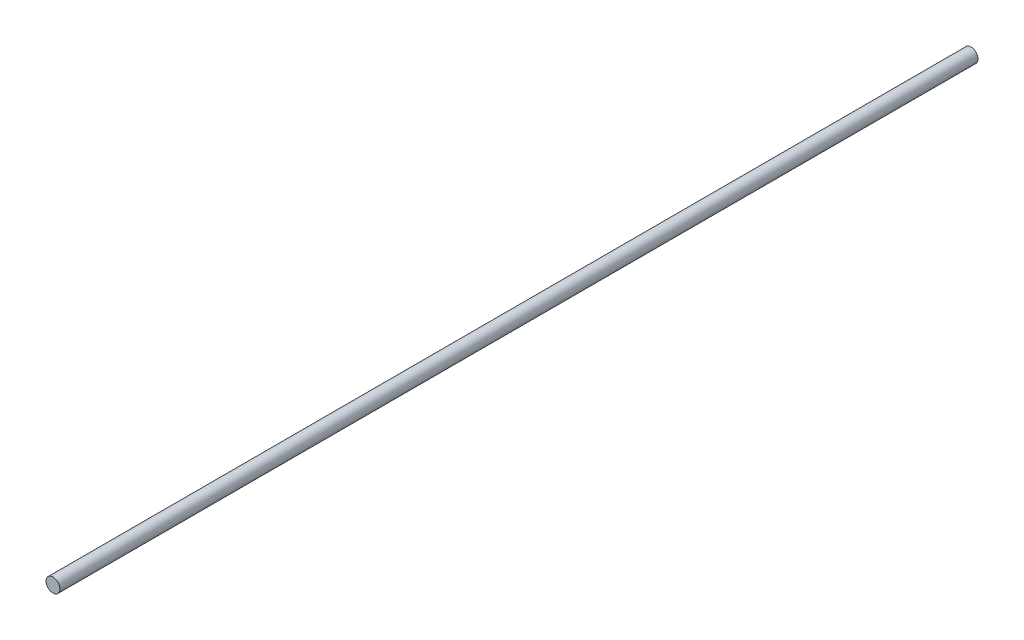
ISO-10303-21;
HEADER;
FILE_DESCRIPTION(('STEP AP214'),'2;1');
FILE_NAME('part.step','',(''),(''),'','','');
FILE_SCHEMA(('AUTOMOTIVE_DESIGN { 1 0 10303 214 1 1 1 1 }'));
ENDSEC;
DATA;
#1=APPLICATION_CONTEXT('core data for automotive mechanical design processes');
#2=APPLICATION_PROTOCOL_DEFINITION('international standard','automotive_design',2000,#1);
#3=PRODUCT_CONTEXT('',#1,'mechanical');
#4=PRODUCT('Part','Part','',(#3));
#5=PRODUCT_RELATED_PRODUCT_CATEGORY('part','',(#4));
#6=PRODUCT_DEFINITION_FORMATION('','',#4);
#7=PRODUCT_DEFINITION_CONTEXT('part definition',#1,'design');
#8=PRODUCT_DEFINITION('design','',#6,#7);
#9=PRODUCT_DEFINITION_SHAPE('','',#8);
#10=(LENGTH_UNIT() NAMED_UNIT(*) SI_UNIT(.MILLI.,.METRE.));
#11=(NAMED_UNIT(*) PLANE_ANGLE_UNIT() SI_UNIT($,.RADIAN.));
#12=(NAMED_UNIT(*) SI_UNIT($,.STERADIAN.) SOLID_ANGLE_UNIT());
#13=UNCERTAINTY_MEASURE_WITH_UNIT(LENGTH_MEASURE(1.E-05),#10,'distance_accuracy_value','');
#14=(GEOMETRIC_REPRESENTATION_CONTEXT(3) GLOBAL_UNCERTAINTY_ASSIGNED_CONTEXT((#13)) GLOBAL_UNIT_ASSIGNED_CONTEXT((#10,
#11,#12)) REPRESENTATION_CONTEXT('',''));
#15=CARTESIAN_POINT('',(0.,0.,0.));
#16=DIRECTION('',(0.,0.,1.));
#17=DIRECTION('',(1.,0.,0.));
#18=AXIS2_PLACEMENT_3D('',#15,#16,#17);
#19=CARTESIAN_POINT('',(0.,0.,210.));
#20=DIRECTION('',(0.,0.,-1.));
#21=DIRECTION('',(-1.,0.,0.));
#22=AXIS2_PLACEMENT_3D('',#19,#20,#21);
#23=CYLINDRICAL_SURFACE('',#22,1.7);
#24=CARTESIAN_POINT('',(0.,0.,210.));
#25=DIRECTION('',(0.,0.,1.));
#26=DIRECTION('',(1.,0.,0.));
#27=AXIS2_PLACEMENT_3D('',#24,#25,#26);
#28=CIRCLE('',#27,1.7);
#29=CARTESIAN_POINT('',(1.7,0.,210.));
#30=VERTEX_POINT('',#29);
#31=EDGE_CURVE('E10',#30,#30,#28,.T.);
#32=ORIENTED_EDGE('',*,*,#31,.F.);
#33=EDGE_LOOP('',(#32));
#34=FACE_BOUND('',#33,.T.);
#35=CARTESIAN_POINT('',(0.,0.,-15.));
#36=DIRECTION('',(0.,0.,-1.));
#37=DIRECTION('',(-1.,0.,0.));
#38=AXIS2_PLACEMENT_3D('',#35,#36,#37);
#39=CIRCLE('',#38,1.7);
#40=CARTESIAN_POINT('',(-1.7,0.,-15.));
#41=VERTEX_POINT('',#40);
#42=EDGE_CURVE('E37',#41,#41,#39,.T.);
#43=ORIENTED_EDGE('',*,*,#42,.F.);
#44=EDGE_LOOP('',(#43));
#45=FACE_BOUND('',#44,.T.);
#46=ADVANCED_FACE('F31',(#34,#45),#23,.T.);
#47=CARTESIAN_POINT('',(0.,0.,210.));
#48=DIRECTION('',(0.,0.,1.));
#49=DIRECTION('',(1.,0.,0.));
#50=AXIS2_PLACEMENT_3D('',#47,#48,#49);
#51=PLANE('',#50);
#52=ORIENTED_EDGE('',*,*,#31,.T.);
#53=EDGE_LOOP('',(#52));
#54=FACE_BOUND('',#53,.T.);
#55=ADVANCED_FACE('F46',(#54),#51,.T.);
#56=CARTESIAN_POINT('',(0.,0.,-15.));
#57=DIRECTION('',(0.,0.,-1.));
#58=DIRECTION('',(-1.,0.,0.));
#59=AXIS2_PLACEMENT_3D('',#56,#57,#58);
#60=PLANE('',#59);
#61=ORIENTED_EDGE('',*,*,#42,.T.);
#62=EDGE_LOOP('',(#61));
#63=FACE_BOUND('',#62,.T.);
#64=ADVANCED_FACE('F43',(#63),#60,.T.);
#65=CLOSED_SHELL('',(#46,#55,#64));
#66=MANIFOLD_SOLID_BREP('B2',#65);
#67=ADVANCED_BREP_SHAPE_REPRESENTATION('',(#18,#66),#14);
#68=SHAPE_DEFINITION_REPRESENTATION(#9,#67);
ENDSEC;
END-ISO-10303-21;
